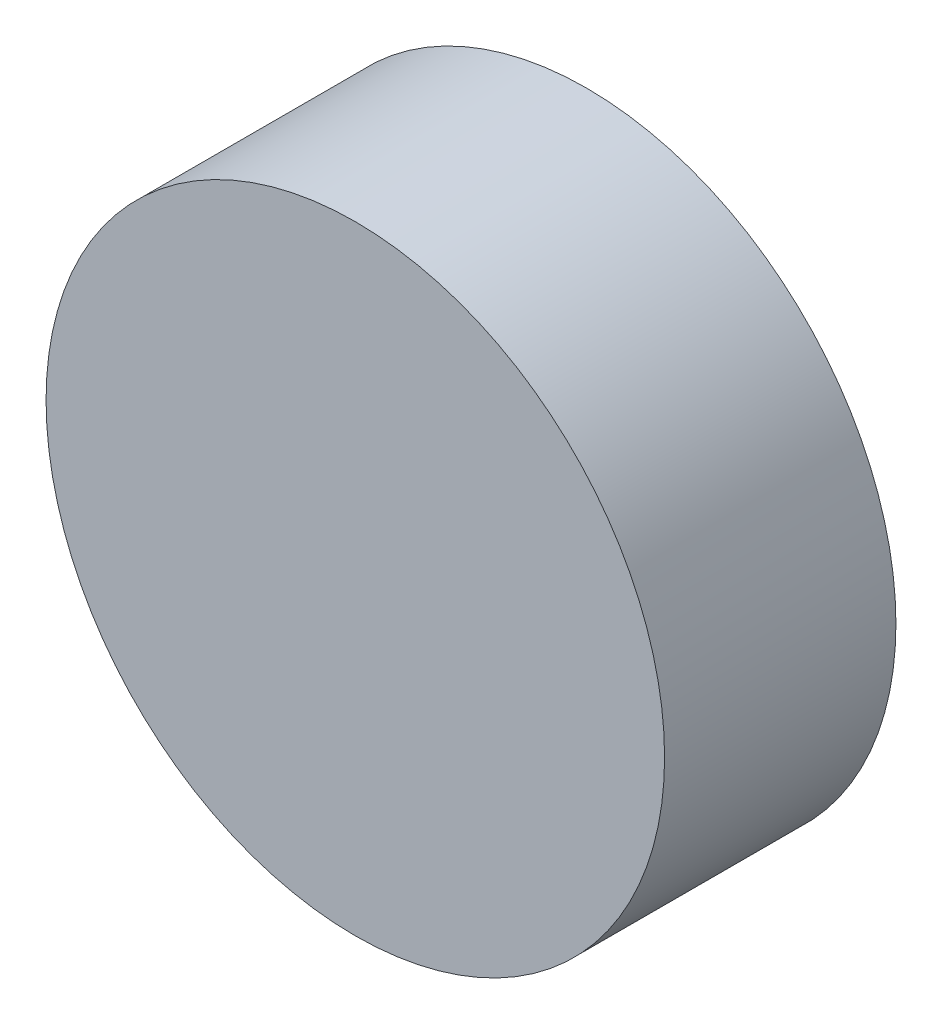
ISO-10303-21;
HEADER;
FILE_DESCRIPTION(('STEP AP214'),'2;1');
FILE_NAME('part.step','',(''),(''),'','','');
FILE_SCHEMA(('AUTOMOTIVE_DESIGN { 1 0 10303 214 1 1 1 1 }'));
ENDSEC;
DATA;
#1=APPLICATION_CONTEXT('core data for automotive mechanical design processes');
#2=APPLICATION_PROTOCOL_DEFINITION('international standard','automotive_design',2000,#1);
#3=PRODUCT_CONTEXT('',#1,'mechanical');
#4=PRODUCT('Part','Part','',(#3));
#5=PRODUCT_RELATED_PRODUCT_CATEGORY('part','',(#4));
#6=PRODUCT_DEFINITION_FORMATION('','',#4);
#7=PRODUCT_DEFINITION_CONTEXT('part definition',#1,'design');
#8=PRODUCT_DEFINITION('design','',#6,#7);
#9=PRODUCT_DEFINITION_SHAPE('','',#8);
#10=(LENGTH_UNIT() NAMED_UNIT(*) SI_UNIT(.MILLI.,.METRE.));
#11=(NAMED_UNIT(*) PLANE_ANGLE_UNIT() SI_UNIT($,.RADIAN.));
#12=(NAMED_UNIT(*) SI_UNIT($,.STERADIAN.) SOLID_ANGLE_UNIT());
#13=UNCERTAINTY_MEASURE_WITH_UNIT(LENGTH_MEASURE(1.E-05),#10,'distance_accuracy_value','');
#14=(GEOMETRIC_REPRESENTATION_CONTEXT(3) GLOBAL_UNCERTAINTY_ASSIGNED_CONTEXT((#13)) GLOBAL_UNIT_ASSIGNED_CONTEXT((#10,
#11,#12)) REPRESENTATION_CONTEXT('',''));
#15=CARTESIAN_POINT('',(0.,0.,0.));
#16=DIRECTION('',(0.,0.,1.));
#17=DIRECTION('',(1.,0.,0.));
#18=AXIS2_PLACEMENT_3D('',#15,#16,#17);
#19=CARTESIAN_POINT('',(0.,0.,4.7498));
#20=DIRECTION('',(0.,0.,-1.));
#21=DIRECTION('',(-1.,0.,0.));
#22=AXIS2_PLACEMENT_3D('',#19,#20,#21);
#23=CYLINDRICAL_SURFACE('',#22,6.35);
#24=CARTESIAN_POINT('',(0.,0.,4.7498));
#25=DIRECTION('',(0.,0.,1.));
#26=DIRECTION('',(1.,0.,0.));
#27=AXIS2_PLACEMENT_3D('',#24,#25,#26);
#28=CIRCLE('',#27,6.35);
#29=CARTESIAN_POINT('',(6.35,0.,4.7498));
#30=VERTEX_POINT('',#29);
#31=EDGE_CURVE('E10',#30,#30,#28,.T.);
#32=ORIENTED_EDGE('',*,*,#31,.F.);
#33=EDGE_LOOP('',(#32));
#34=FACE_BOUND('',#33,.T.);
#35=CARTESIAN_POINT('',(0.,0.,0.));
#36=DIRECTION('',(0.,0.,1.));
#37=DIRECTION('',(1.,0.,0.));
#38=AXIS2_PLACEMENT_3D('',#35,#36,#37);
#39=CIRCLE('',#38,6.35);
#40=CARTESIAN_POINT('',(6.35,0.,0.));
#41=VERTEX_POINT('',#40);
#42=EDGE_CURVE('E46',#41,#41,#39,.T.);
#43=ORIENTED_EDGE('',*,*,#42,.T.);
#44=EDGE_LOOP('',(#43));
#45=FACE_BOUND('',#44,.T.);
#46=ADVANCED_FACE('F43',(#34,#45),#23,.T.);
#47=CARTESIAN_POINT('',(0.,0.,4.7498));
#48=DIRECTION('',(0.,0.,1.));
#49=DIRECTION('',(1.,0.,0.));
#50=AXIS2_PLACEMENT_3D('',#47,#48,#49);
#51=PLANE('',#50);
#52=ORIENTED_EDGE('',*,*,#31,.T.);
#53=EDGE_LOOP('',(#52));
#54=FACE_BOUND('',#53,.T.);
#55=ADVANCED_FACE('F60',(#54),#51,.T.);
#56=CARTESIAN_POINT('',(0.,0.,0.));
#57=DIRECTION('',(0.,0.,1.));
#58=DIRECTION('',(1.,0.,0.));
#59=AXIS2_PLACEMENT_3D('',#56,#57,#58);
#60=PLANE('',#59);
#61=ORIENTED_EDGE('',*,*,#42,.F.);
#62=EDGE_LOOP('',(#61));
#63=FACE_BOUND('',#62,.T.);
#64=ADVANCED_FACE('F58',(#63),#60,.F.);
#65=CLOSED_SHELL('',(#46,#55,#64));
#66=MANIFOLD_SOLID_BREP('B2',#65);
#67=ADVANCED_BREP_SHAPE_REPRESENTATION('',(#18,#66),#14);
#68=SHAPE_DEFINITION_REPRESENTATION(#9,#67);
ENDSEC;
END-ISO-10303-21;
